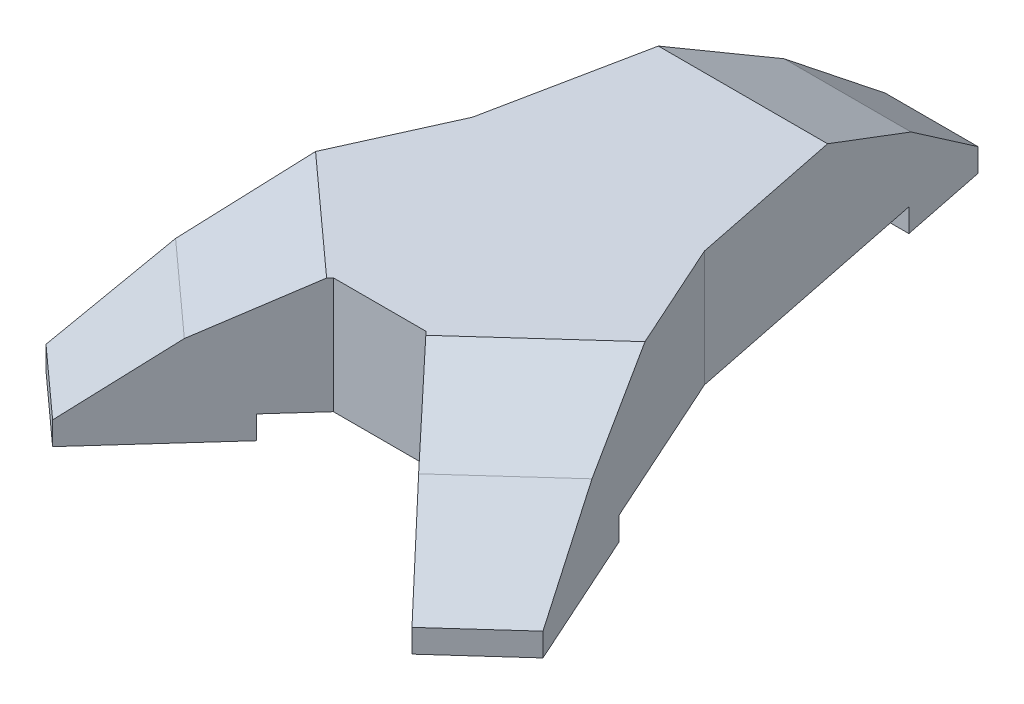
ISO-10303-21;
HEADER;
FILE_DESCRIPTION(('STEP AP214'),'2;1');
FILE_NAME('part.step','',(''),(''),'','','');
FILE_SCHEMA(('AUTOMOTIVE_DESIGN { 1 0 10303 214 1 1 1 1 }'));
ENDSEC;
DATA;
#1=APPLICATION_CONTEXT('core data for automotive mechanical design processes');
#2=APPLICATION_PROTOCOL_DEFINITION('international standard','automotive_design',2000,#1);
#3=PRODUCT_CONTEXT('',#1,'mechanical');
#4=PRODUCT('Part','Part','',(#3));
#5=PRODUCT_RELATED_PRODUCT_CATEGORY('part','',(#4));
#6=PRODUCT_DEFINITION_FORMATION('','',#4);
#7=PRODUCT_DEFINITION_CONTEXT('part definition',#1,'design');
#8=PRODUCT_DEFINITION('design','',#6,#7);
#9=PRODUCT_DEFINITION_SHAPE('','',#8);
#10=(LENGTH_UNIT() NAMED_UNIT(*) SI_UNIT(.MILLI.,.METRE.));
#11=(NAMED_UNIT(*) PLANE_ANGLE_UNIT() SI_UNIT($,.RADIAN.));
#12=(NAMED_UNIT(*) SI_UNIT($,.STERADIAN.) SOLID_ANGLE_UNIT());
#13=UNCERTAINTY_MEASURE_WITH_UNIT(LENGTH_MEASURE(1.E-05),#10,'distance_accuracy_value','');
#14=(GEOMETRIC_REPRESENTATION_CONTEXT(3) GLOBAL_UNCERTAINTY_ASSIGNED_CONTEXT((#13)) GLOBAL_UNIT_ASSIGNED_CONTEXT((#10,
#11,#12)) REPRESENTATION_CONTEXT('',''));
#15=CARTESIAN_POINT('',(0.,0.,0.));
#16=DIRECTION('',(0.,0.,1.));
#17=DIRECTION('',(1.,0.,0.));
#18=AXIS2_PLACEMENT_3D('',#15,#16,#17);
#19=CARTESIAN_POINT('',(-12.7,6.35,55.3152646220788));
#20=DIRECTION('',(0.,0.,-1.));
#21=DIRECTION('',(-1.,0.,0.));
#22=AXIS2_PLACEMENT_3D('',#19,#20,#21);
#23=PLANE('',#22);
#24=DIRECTION('',(-1.,0.,0.));
#25=VECTOR('',#24,1.);
#26=CARTESIAN_POINT('',(0.,6.35,55.3152646220788));
#27=LINE('',#26,#25);
#28=CARTESIAN_POINT('',(12.7,6.35,55.3152646220788));
#29=VERTEX_POINT('',#28);
#30=CARTESIAN_POINT('',(-12.7,6.35,55.3152646220788));
#31=VERTEX_POINT('',#30);
#32=EDGE_CURVE('E293',#29,#31,#27,.T.);
#33=ORIENTED_EDGE('',*,*,#32,.F.);
#34=DIRECTION('',(0.,-1.,0.));
#35=VECTOR('',#34,1.);
#36=CARTESIAN_POINT('',(12.7,6.35,55.3152646220788));
#37=LINE('',#36,#35);
#38=CARTESIAN_POINT('',(12.7,38.1,55.3152646220788));
#39=VERTEX_POINT('',#38);
#40=EDGE_CURVE('E209',#39,#29,#37,.T.);
#41=ORIENTED_EDGE('',*,*,#40,.F.);
#42=DIRECTION('',(1.,0.,0.));
#43=VECTOR('',#42,1.);
#44=CARTESIAN_POINT('',(0.,38.1,55.3152646220788));
#45=LINE('',#44,#43);
#46=CARTESIAN_POINT('',(-12.7,38.1,55.3152646220788));
#47=VERTEX_POINT('',#46);
#48=EDGE_CURVE('E299',#47,#39,#45,.T.);
#49=ORIENTED_EDGE('',*,*,#48,.F.);
#50=DIRECTION('',(0.,-1.,0.));
#51=VECTOR('',#50,1.);
#52=CARTESIAN_POINT('',(-12.7,6.35,55.3152646220788));
#53=LINE('',#52,#51);
#54=EDGE_CURVE('E345',#47,#31,#53,.T.);
#55=ORIENTED_EDGE('',*,*,#54,.T.);
#56=EDGE_LOOP('',(#33,#41,#49,#55));
#57=FACE_BOUND('',#56,.T.);
#58=ADVANCED_FACE('F32',(#57),#23,.F.);
#59=CARTESIAN_POINT('',(0.,0.,55.3152646220788));
#60=DIRECTION('',(0.,1.,0.));
#61=DIRECTION('',(0.,0.,1.));
#62=AXIS2_PLACEMENT_3D('',#59,#60,#61);
#63=PLANE('',#62);
#64=DIRECTION('',(-1.,0.,0.));
#65=VECTOR('',#64,1.);
#66=CARTESIAN_POINT('',(0.,0.,-95.814735377912));
#67=LINE('',#66,#65);
#68=CARTESIAN_POINT('',(12.7,0.,-95.814735377912));
#69=VERTEX_POINT('',#68);
#70=CARTESIAN_POINT('',(-12.7,0.,-95.814735377912));
#71=VERTEX_POINT('',#70);
#72=EDGE_CURVE('E326',#69,#71,#67,.T.);
#73=ORIENTED_EDGE('',*,*,#72,.F.);
#74=DIRECTION('',(0.198662427795257,0.,0.980067977123268));
#75=VECTOR('',#74,1.);
#76=CARTESIAN_POINT('',(12.7,0.,-95.814735377912));
#77=LINE('',#76,#75);
#78=CARTESIAN_POINT('',(17.5137930465512,0.,-72.0666896815926));
#79=VERTEX_POINT('',#78);
#80=EDGE_CURVE('E239',#69,#79,#77,.T.);
#81=ORIENTED_EDGE('',*,*,#80,.T.);
#82=DIRECTION('',(1.,0.,0.));
#83=VECTOR('',#82,1.);
#84=CARTESIAN_POINT('',(-17.5137930465512,0.,-72.0666896815926));
#85=LINE('',#84,#83);
#86=CARTESIAN_POINT('',(-17.5137930465512,0.,-72.0666896815926));
#87=VERTEX_POINT('',#86);
#88=EDGE_CURVE('E283',#87,#79,#85,.T.);
#89=ORIENTED_EDGE('',*,*,#88,.F.);
#90=DIRECTION('',(-0.198662427795257,0.,0.980067977123268));
#91=VECTOR('',#90,1.);
#92=CARTESIAN_POINT('',(-12.7,0.,-95.814735377912));
#93=LINE('',#92,#91);
#94=EDGE_CURVE('E347',#71,#87,#93,.T.);
#95=ORIENTED_EDGE('',*,*,#94,.F.);
#96=EDGE_LOOP('',(#73,#81,#89,#95));
#97=FACE_BOUND('',#96,.T.);
#98=ADVANCED_FACE('F393',(#97),#63,.F.);
#99=CARTESIAN_POINT('',(-49.2051840328091,6.35,95.7036977876351));
#100=DIRECTION('',(-0.741871355145552,0.,-0.670542237606627));
#101=DIRECTION('',(-0.670542237606627,0.,0.741871355145552));
#102=AXIS2_PLACEMENT_3D('',#99,#100,#101);
#103=PLANE('',#102);
#104=DIRECTION('',(0.670542237606627,0.,-0.741871355145552));
#105=VECTOR('',#104,1.);
#106=CARTESIAN_POINT('',(-49.2051840328091,0.,95.7036977876351));
#107=LINE('',#106,#105);
#108=CARTESIAN_POINT('',(-49.2051840328091,0.,95.7036977876351));
#109=VERTEX_POINT('',#108);
#110=CARTESIAN_POINT('',(-22.7010488999517,0.,66.3801778880448));
#111=VERTEX_POINT('',#110);
#112=EDGE_CURVE('E342',#109,#111,#107,.T.);
#113=ORIENTED_EDGE('',*,*,#112,.T.);
#114=DIRECTION('',(0.,-1.,0.));
#115=VECTOR('',#114,1.);
#116=CARTESIAN_POINT('',(-22.7010488999517,6.35,66.3801778880448));
#117=LINE('',#116,#115);
#118=CARTESIAN_POINT('',(-22.7010488999517,6.35,66.3801778880448));
#119=VERTEX_POINT('',#118);
#120=EDGE_CURVE('E49',#119,#111,#117,.T.);
#121=ORIENTED_EDGE('',*,*,#120,.F.);
#122=DIRECTION('',(-0.670542237606626,0.,0.741871355145553));
#123=VECTOR('',#122,1.);
#124=CARTESIAN_POINT('',(-12.7,6.35,55.3152646220788));
#125=LINE('',#124,#123);
#126=EDGE_CURVE('E280',#31,#119,#125,.T.);
#127=ORIENTED_EDGE('',*,*,#126,.F.);
#128=ORIENTED_EDGE('',*,*,#54,.F.);
#129=DIRECTION('',(-0.670542237606627,0.,0.741871355145552));
#130=VECTOR('',#129,1.);
#131=CARTESIAN_POINT('',(-13.5797727730859,38.1,56.2886234692694));
#132=LINE('',#131,#130);
#133=CARTESIAN_POINT('',(-13.5797727730859,38.1,56.2886234692694));
#134=VERTEX_POINT('',#133);
#135=EDGE_CURVE('E313',#47,#134,#132,.T.);
#136=ORIENTED_EDGE('',*,*,#135,.T.);
#137=DIRECTION('',(-0.603448054828355,-0.436012915201094,0.667640009961745));
#138=VECTOR('',#137,1.);
#139=CARTESIAN_POINT('',(-32.0789925620562,24.7336486055474,76.7557029227042));
#140=LINE('',#139,#138);
#141=CARTESIAN_POINT('',(-32.0789925620562,24.7336486055474,76.7557029227042));
#142=VERTEX_POINT('',#141);
#143=EDGE_CURVE('E328',#134,#142,#140,.T.);
#144=ORIENTED_EDGE('',*,*,#143,.T.);
#145=DIRECTION('',(-0.544225984758208,-0.584184713973834,0.602118175670913));
#146=VECTOR('',#145,1.);
#147=CARTESIAN_POINT('',(-49.2051840328091,6.35,95.7036977876351));
#148=LINE('',#147,#146);
#149=CARTESIAN_POINT('',(-49.2051840328091,6.35,95.7036977876351));
#150=VERTEX_POINT('',#149);
#151=EDGE_CURVE('E331',#142,#150,#148,.T.);
#152=ORIENTED_EDGE('',*,*,#151,.T.);
#153=DIRECTION('',(0.,-1.,0.));
#154=VECTOR('',#153,1.);
#155=CARTESIAN_POINT('',(-49.2051840328091,6.35,95.7036977876351));
#156=LINE('',#155,#154);
#157=EDGE_CURVE('E356',#150,#109,#156,.T.);
#158=ORIENTED_EDGE('',*,*,#157,.T.);
#159=EDGE_LOOP('',(#113,#121,#127,#128,#136,#144,#152,#158));
#160=FACE_BOUND('',#159,.T.);
#161=ADVANCED_FACE('F409',(#160),#103,.F.);
#162=CARTESIAN_POINT('',(-31.75,6.35,-1.83473537791201));
#163=DIRECTION('',(0.911621588614959,0.,0.411030508808213));
#164=DIRECTION('',(0.411030508808214,0.,-0.911621588614959));
#165=AXIS2_PLACEMENT_3D('',#162,#163,#164);
#166=PLANE('',#165);
#167=DIRECTION('',(0.411030508808214,0.,-0.911621588614959));
#168=VECTOR('',#167,1.);
#169=CARTESIAN_POINT('',(-50.9815492834304,6.35,40.8187784941399));
#170=LINE('',#169,#168);
#171=CARTESIAN_POINT('',(-50.9815492834304,6.35,40.8187784941399));
#172=VERTEX_POINT('',#171);
#173=CARTESIAN_POINT('',(-31.75,6.35,-1.83473537791201));
#174=VERTEX_POINT('',#173);
#175=EDGE_CURVE('E286',#172,#174,#170,.T.);
#176=ORIENTED_EDGE('',*,*,#175,.F.);
#177=DIRECTION('',(0.,-1.,0.));
#178=VECTOR('',#177,1.);
#179=CARTESIAN_POINT('',(-50.9815492834304,6.35,40.8187784941399));
#180=LINE('',#179,#178);
#181=CARTESIAN_POINT('',(-50.9815492834304,0.,40.8187784941399));
#182=VERTEX_POINT('',#181);
#183=EDGE_CURVE('E300',#172,#182,#180,.T.);
#184=ORIENTED_EDGE('',*,*,#183,.T.);
#185=DIRECTION('',(-0.411030508808214,0.,0.911621588614959));
#186=VECTOR('',#185,1.);
#187=CARTESIAN_POINT('',(-31.75,0.,-1.83473537791201));
#188=LINE('',#187,#186);
#189=CARTESIAN_POINT('',(-68.0487164535061,0.,78.6719249524268));
#190=VERTEX_POINT('',#189);
#191=EDGE_CURVE('E350',#182,#190,#188,.T.);
#192=ORIENTED_EDGE('',*,*,#191,.T.);
#193=DIRECTION('',(0.,-1.,0.));
#194=VECTOR('',#193,1.);
#195=CARTESIAN_POINT('',(-68.0487164535061,6.35,78.6719249524268));
#196=LINE('',#195,#194);
#197=CARTESIAN_POINT('',(-68.0487164535061,6.35,78.6719249524268));
#198=VERTEX_POINT('',#197);
#199=EDGE_CURVE('E359',#198,#190,#196,.T.);
#200=ORIENTED_EDGE('',*,*,#199,.F.);
#201=DIRECTION('',(0.339075065566947,0.565221878622035,-0.752032132184356));
#202=VECTOR('',#201,1.);
#203=CARTESIAN_POINT('',(-56.1172254727613,26.2392234544651,52.2091575195431));
#204=LINE('',#203,#202);
#205=CARTESIAN_POINT('',(-57.0204157240964,24.7336486055474,54.2123366366627));
#206=VERTEX_POINT('',#205);
#207=EDGE_CURVE('E324',#198,#206,#204,.T.);
#208=ORIENTED_EDGE('',*,*,#207,.T.);
#209=DIRECTION('',(0.373247600320152,0.418801936448978,-0.827823149520376));
#210=VECTOR('',#209,1.);
#211=CARTESIAN_POINT('',(-43.416255905428,39.998176685387,24.0397691023803));
#212=LINE('',#211,#210);
#213=CARTESIAN_POINT('',(-45.1079622495095,38.1,27.7917923508082));
#214=VERTEX_POINT('',#213);
#215=EDGE_CURVE('E321',#206,#214,#212,.T.);
#216=ORIENTED_EDGE('',*,*,#215,.T.);
#217=DIRECTION('',(0.411030508808214,0.,-0.911621588614959));
#218=VECTOR('',#217,1.);
#219=CARTESIAN_POINT('',(-29.728151821124,38.1,-6.31897781069268));
#220=LINE('',#219,#218);
#221=CARTESIAN_POINT('',(-31.75,38.1,-1.83473537791195));
#222=VERTEX_POINT('',#221);
#223=EDGE_CURVE('E319',#214,#222,#220,.T.);
#224=ORIENTED_EDGE('',*,*,#223,.T.);
#225=DIRECTION('',(0.,-1.,0.));
#226=VECTOR('',#225,1.);
#227=CARTESIAN_POINT('',(-31.75,6.35,-1.83473537791201));
#228=LINE('',#227,#226);
#229=EDGE_CURVE('E41',#222,#174,#228,.T.);
#230=ORIENTED_EDGE('',*,*,#229,.T.);
#231=EDGE_LOOP('',(#176,#184,#192,#200,#208,#216,#224,#230));
#232=FACE_BOUND('',#231,.T.);
#233=ADVANCED_FACE('F367',(#232),#166,.F.);
#234=CARTESIAN_POINT('',(0.,6.35,-95.814735377912));
#235=DIRECTION('',(0.,0.,1.));
#236=DIRECTION('',(1.,0.,0.));
#237=AXIS2_PLACEMENT_3D('',#234,#235,#236);
#238=PLANE('',#237);
#239=ORIENTED_EDGE('',*,*,#72,.T.);
#240=DIRECTION('',(0.,-1.,0.));
#241=VECTOR('',#240,1.);
#242=CARTESIAN_POINT('',(-12.7,6.35,-95.814735377912));
#243=LINE('',#242,#241);
#244=CARTESIAN_POINT('',(-12.7,6.35,-95.814735377912));
#245=VERTEX_POINT('',#244);
#246=EDGE_CURVE('E11',#245,#71,#243,.T.);
#247=ORIENTED_EDGE('',*,*,#246,.F.);
#248=DIRECTION('',(-1.,0.,0.));
#249=VECTOR('',#248,1.);
#250=CARTESIAN_POINT('',(0.,6.35,-95.814735377912));
#251=LINE('',#250,#249);
#252=CARTESIAN_POINT('',(12.7,6.35,-95.814735377912));
#253=VERTEX_POINT('',#252);
#254=EDGE_CURVE('E338',#253,#245,#251,.T.);
#255=ORIENTED_EDGE('',*,*,#254,.F.);
#256=DIRECTION('',(0.,-1.,0.));
#257=VECTOR('',#256,1.);
#258=CARTESIAN_POINT('',(12.7,6.35,-95.814735377912));
#259=LINE('',#258,#257);
#260=EDGE_CURVE('E269',#253,#69,#259,.T.);
#261=ORIENTED_EDGE('',*,*,#260,.T.);
#262=EDGE_LOOP('',(#239,#247,#255,#261));
#263=FACE_BOUND('',#262,.T.);
#264=ADVANCED_FACE('F34',(#263),#238,.F.);
#265=CARTESIAN_POINT('',(-12.7,6.35,-95.814735377912));
#266=DIRECTION('',(0.980067977123268,0.,0.198662427795257));
#267=DIRECTION('',(0.198662427795257,0.,-0.980067977123268));
#268=AXIS2_PLACEMENT_3D('',#265,#266,#267);
#269=PLANE('',#268);
#270=ORIENTED_EDGE('',*,*,#94,.T.);
#271=DIRECTION('',(0.,-1.,0.));
#272=VECTOR('',#271,1.);
#273=CARTESIAN_POINT('',(-17.5137930465512,6.35,-72.0666896815926));
#274=LINE('',#273,#272);
#275=CARTESIAN_POINT('',(-17.5137930465512,6.35,-72.0666896815926));
#276=VERTEX_POINT('',#275);
#277=EDGE_CURVE('E297',#276,#87,#274,.T.);
#278=ORIENTED_EDGE('',*,*,#277,.F.);
#279=DIRECTION('',(0.198662427795257,0.,-0.980067977123268));
#280=VECTOR('',#279,1.);
#281=CARTESIAN_POINT('',(-31.75,6.35,-1.83473537791201));
#282=LINE('',#281,#280);
#283=EDGE_CURVE('E288',#174,#276,#282,.T.);
#284=ORIENTED_EDGE('',*,*,#283,.F.);
#285=ORIENTED_EDGE('',*,*,#229,.F.);
#286=DIRECTION('',(-0.198662427795257,0.,0.980067977123268));
#287=VECTOR('',#286,1.);
#288=CARTESIAN_POINT('',(-35.3289254631246,38.1,15.8212969068361));
#289=LINE('',#288,#287);
#290=CARTESIAN_POINT('',(-23.172431216904,38.1,-44.1507413745192));
#291=VERTEX_POINT('',#290);
#292=EDGE_CURVE('E306',#291,#222,#289,.T.);
#293=ORIENTED_EDGE('',*,*,#292,.F.);
#294=DIRECTION('',(-0.178136601307639,0.442679566158868,0.878807233117684));
#295=VECTOR('',#294,1.);
#296=CARTESIAN_POINT('',(-26.322200819078,45.9273562578125,-28.6118780037939));
#297=LINE('',#296,#295);
#298=CARTESIAN_POINT('',(-17.3671205335689,23.6734734139333,-72.7902740789722));
#299=VERTEX_POINT('',#298);
#300=EDGE_CURVE('E310',#299,#291,#297,.T.);
#301=ORIENTED_EDGE('',*,*,#300,.F.);
#302=DIRECTION('',(-0.159891923663756,0.593488740813308,0.788800156741197));
#303=VECTOR('',#302,1.);
#304=CARTESIAN_POINT('',(-20.0531495283154,33.6435077305664,-59.5391977048896));
#305=LINE('',#304,#303);
#306=EDGE_CURVE('E309',#245,#299,#305,.T.);
#307=ORIENTED_EDGE('',*,*,#306,.F.);
#308=ORIENTED_EDGE('',*,*,#246,.T.);
#309=EDGE_LOOP('',(#270,#278,#284,#285,#293,#301,#307,#308));
#310=FACE_BOUND('',#309,.T.);
#311=ADVANCED_FACE('F375',(#310),#269,.F.);
#312=CARTESIAN_POINT('',(-68.0487164535061,6.35,78.6719249524268));
#313=DIRECTION('',(0.670542237606627,0.,-0.741871355145552));
#314=DIRECTION('',(-0.741871355145552,0.,-0.670542237606627));
#315=AXIS2_PLACEMENT_3D('',#312,#313,#314);
#316=PLANE('',#315);
#317=DIRECTION('',(0.741871355145552,0.,0.670542237606627));
#318=VECTOR('',#317,1.);
#319=CARTESIAN_POINT('',(-68.0487164535061,0.,78.6719249524268));
#320=LINE('',#319,#318);
#321=EDGE_CURVE('E352',#190,#109,#320,.T.);
#322=ORIENTED_EDGE('',*,*,#321,.T.);
#323=ORIENTED_EDGE('',*,*,#157,.F.);
#324=DIRECTION('',(0.741871355145552,0.,0.670542237606627));
#325=VECTOR('',#324,1.);
#326=CARTESIAN_POINT('',(-68.0487164535061,6.35,78.6719249524268));
#327=LINE('',#326,#325);
#328=EDGE_CURVE('E341',#198,#150,#327,.T.);
#329=ORIENTED_EDGE('',*,*,#328,.F.);
#330=ORIENTED_EDGE('',*,*,#199,.T.);
#331=EDGE_LOOP('',(#322,#323,#329,#330));
#332=FACE_BOUND('',#331,.T.);
#333=ADVANCED_FACE('F406',(#332),#316,.F.);
#334=ORIENTED_EDGE('',*,*,#191,.F.);
#335=DIRECTION('',(-0.741871355145552,0.,-0.670542237606627));
#336=VECTOR('',#335,1.);
#337=CARTESIAN_POINT('',(-22.7010488999517,0.,66.3801778880448));
#338=LINE('',#337,#336);
#339=EDGE_CURVE('E272',#111,#182,#338,.T.);
#340=ORIENTED_EDGE('',*,*,#339,.F.);
#341=ORIENTED_EDGE('',*,*,#112,.F.);
#342=ORIENTED_EDGE('',*,*,#321,.F.);
#343=EDGE_LOOP('',(#334,#340,#341,#342));
#344=FACE_BOUND('',#343,.T.);
#345=ADVANCED_FACE('F403',(#344),#63,.F.);
#346=CARTESIAN_POINT('',(-171.346065287698,6.35,-14.6936362674454));
#347=DIRECTION('',(-0.391720525283602,0.811620736526187,0.433389905411085));
#348=DIRECTION('',(0.,-0.471032847970125,0.882115670495176));
#349=AXIS2_PLACEMENT_3D('',#346,#347,#348);
#350=PLANE('',#349);
#351=ORIENTED_EDGE('',*,*,#207,.F.);
#352=ORIENTED_EDGE('',*,*,#328,.T.);
#353=ORIENTED_EDGE('',*,*,#151,.F.);
#354=DIRECTION('',(0.741871355145552,0.,0.670542237606627));
#355=VECTOR('',#354,1.);
#356=CARTESIAN_POINT('',(-154.219873816946,24.7336486055474,-33.6416311323763));
#357=LINE('',#356,#355);
#358=EDGE_CURVE('E322',#206,#142,#357,.T.);
#359=ORIENTED_EDGE('',*,*,#358,.F.);
#360=EDGE_LOOP('',(#351,#352,#353,#359));
#361=FACE_BOUND('',#360,.T.);
#362=ADVANCED_FACE('F415',(#361),#350,.T.);
#363=CARTESIAN_POINT('',(-154.219873816946,24.7336486055474,-33.6416311323763));
#364=DIRECTION('',(-0.29236507578433,0.899940407903681,0.323465492261198));
#365=DIRECTION('',(0.,-0.338244481942432,0.941058271540873));
#366=AXIS2_PLACEMENT_3D('',#363,#364,#365);
#367=PLANE('',#366);
#368=ORIENTED_EDGE('',*,*,#215,.F.);
#369=ORIENTED_EDGE('',*,*,#358,.T.);
#370=ORIENTED_EDGE('',*,*,#143,.F.);
#371=DIRECTION('',(0.741871355145552,0.,0.670542237606627));
#372=VECTOR('',#371,1.);
#373=CARTESIAN_POINT('',(-135.720654027975,38.1,-54.1087105858111));
#374=LINE('',#373,#372);
#375=EDGE_CURVE('E334',#214,#134,#374,.T.);
#376=ORIENTED_EDGE('',*,*,#375,.F.);
#377=EDGE_LOOP('',(#368,#369,#370,#376));
#378=FACE_BOUND('',#377,.T.);
#379=ADVANCED_FACE('F417',(#378),#367,.T.);
#380=CARTESIAN_POINT('',(-135.720654027975,38.1,-54.1087105858111));
#381=DIRECTION('',(0.,1.,0.));
#382=DIRECTION('',(0.,0.,1.));
#383=AXIS2_PLACEMENT_3D('',#380,#381,#382);
#384=PLANE('',#383);
#385=ORIENTED_EDGE('',*,*,#48,.T.);
#386=DIRECTION('',(0.670542237606627,0.,0.741871355145552));
#387=VECTOR('',#386,1.);
#388=CARTESIAN_POINT('',(13.5797727730859,38.1,56.2886234692694));
#389=LINE('',#388,#387);
#390=CARTESIAN_POINT('',(13.5797727730859,38.1,56.2886234692694));
#391=VERTEX_POINT('',#390);
#392=EDGE_CURVE('E226',#39,#391,#389,.T.);
#393=ORIENTED_EDGE('',*,*,#392,.T.);
#394=DIRECTION('',(-0.741871355145552,0.,0.670542237606627));
#395=VECTOR('',#394,1.);
#396=CARTESIAN_POINT('',(135.720654027975,38.1,-54.1087105858111));
#397=LINE('',#396,#395);
#398=CARTESIAN_POINT('',(45.1079622495095,38.1,27.7917923508082));
#399=VERTEX_POINT('',#398);
#400=EDGE_CURVE('E248',#399,#391,#397,.T.);
#401=ORIENTED_EDGE('',*,*,#400,.F.);
#402=DIRECTION('',(-0.411030508808214,0.,-0.911621588614959));
#403=VECTOR('',#402,1.);
#404=CARTESIAN_POINT('',(29.728151821124,38.1,-6.31897781069268));
#405=LINE('',#404,#403);
#406=CARTESIAN_POINT('',(31.75,38.1,-1.83473537791195));
#407=VERTEX_POINT('',#406);
#408=EDGE_CURVE('E229',#399,#407,#405,.T.);
#409=ORIENTED_EDGE('',*,*,#408,.T.);
#410=DIRECTION('',(0.198662427795257,0.,0.980067977123268));
#411=VECTOR('',#410,1.);
#412=CARTESIAN_POINT('',(35.3289254631246,38.1,15.8212969068361));
#413=LINE('',#412,#411);
#414=CARTESIAN_POINT('',(23.172431216904,38.1,-44.1507413745192));
#415=VERTEX_POINT('',#414);
#416=EDGE_CURVE('E221',#415,#407,#413,.T.);
#417=ORIENTED_EDGE('',*,*,#416,.F.);
#418=DIRECTION('',(1.,0.,0.));
#419=VECTOR('',#418,1.);
#420=CARTESIAN_POINT('',(-122.432018067882,38.1,-44.1507413745192));
#421=LINE('',#420,#419);
#422=EDGE_CURVE('E315',#291,#415,#421,.T.);
#423=ORIENTED_EDGE('',*,*,#422,.F.);
#424=ORIENTED_EDGE('',*,*,#292,.T.);
#425=ORIENTED_EDGE('',*,*,#223,.F.);
#426=ORIENTED_EDGE('',*,*,#375,.T.);
#427=ORIENTED_EDGE('',*,*,#135,.F.);
#428=EDGE_LOOP('',(#385,#393,#401,#409,#417,#423,#424,#425,#426,#427));
#429=FACE_BOUND('',#428,.T.);
#430=ADVANCED_FACE('F373',(#429),#384,.T.);
#431=CARTESIAN_POINT('',(-122.432018067882,38.1,-44.1507413745192));
#432=DIRECTION('',(0.,-0.893091546594061,0.449874970855489));
#433=DIRECTION('',(0.,-0.44987497085549,-0.893091546594062));
#434=AXIS2_PLACEMENT_3D('',#431,#432,#433);
#435=PLANE('',#434);
#436=DIRECTION('',(1.,0.,0.));
#437=VECTOR('',#436,1.);
#438=CARTESIAN_POINT('',(-122.432018067882,23.6734734139333,-72.7902740789722));
#439=LINE('',#438,#437);
#440=CARTESIAN_POINT('',(17.3671205335689,23.6734734139333,-72.7902740789722));
#441=VERTEX_POINT('',#440);
#442=EDGE_CURVE('E305',#299,#441,#439,.T.);
#443=ORIENTED_EDGE('',*,*,#442,.F.);
#444=ORIENTED_EDGE('',*,*,#300,.T.);
#445=ORIENTED_EDGE('',*,*,#422,.T.);
#446=DIRECTION('',(0.178136601307639,0.442679566158868,0.878807233117684));
#447=VECTOR('',#446,1.);
#448=CARTESIAN_POINT('',(26.322200819078,45.9273562578125,-28.6118780037939));
#449=LINE('',#448,#447);
#450=EDGE_CURVE('E219',#441,#415,#449,.T.);
#451=ORIENTED_EDGE('',*,*,#450,.F.);
#452=EDGE_LOOP('',(#443,#444,#445,#451));
#453=FACE_BOUND('',#452,.T.);
#454=ADVANCED_FACE('F383',(#453),#435,.F.);
#455=CARTESIAN_POINT('',(-122.432018067882,23.6734734139333,-72.7902740789722));
#456=DIRECTION('',(0.,-0.799080708690871,0.601223769488613));
#457=DIRECTION('',(0.,-0.601223769488613,-0.79908070869087));
#458=AXIS2_PLACEMENT_3D('',#455,#456,#457);
#459=PLANE('',#458);
#460=ORIENTED_EDGE('',*,*,#254,.T.);
#461=ORIENTED_EDGE('',*,*,#306,.T.);
#462=ORIENTED_EDGE('',*,*,#442,.T.);
#463=DIRECTION('',(0.159891923663756,0.593488740813308,0.788800156741197));
#464=VECTOR('',#463,1.);
#465=CARTESIAN_POINT('',(20.0531495283154,33.6435077305664,-59.5391977048896));
#466=LINE('',#465,#464);
#467=EDGE_CURVE('E223',#253,#441,#466,.T.);
#468=ORIENTED_EDGE('',*,*,#467,.F.);
#469=EDGE_LOOP('',(#460,#461,#462,#468));
#470=FACE_BOUND('',#469,.T.);
#471=ADVANCED_FACE('F380',(#470),#459,.F.);
#472=CARTESIAN_POINT('',(-17.5137930465512,6.35,-72.0666896815926));
#473=DIRECTION('',(0.,0.,-1.));
#474=DIRECTION('',(-1.,0.,0.));
#475=AXIS2_PLACEMENT_3D('',#472,#473,#474);
#476=PLANE('',#475);
#477=ORIENTED_EDGE('',*,*,#88,.T.);
#478=DIRECTION('',(0.,-1.,0.));
#479=VECTOR('',#478,1.);
#480=CARTESIAN_POINT('',(17.5137930465512,6.35,-72.0666896815926));
#481=LINE('',#480,#479);
#482=CARTESIAN_POINT('',(17.5137930465512,6.35,-72.0666896815926));
#483=VERTEX_POINT('',#482);
#484=EDGE_CURVE('E216',#483,#79,#481,.T.);
#485=ORIENTED_EDGE('',*,*,#484,.F.);
#486=DIRECTION('',(1.,0.,0.));
#487=VECTOR('',#486,1.);
#488=CARTESIAN_POINT('',(-17.5137930465512,6.35,-72.0666896815926));
#489=LINE('',#488,#487);
#490=EDGE_CURVE('E291',#276,#483,#489,.T.);
#491=ORIENTED_EDGE('',*,*,#490,.F.);
#492=ORIENTED_EDGE('',*,*,#277,.T.);
#493=EDGE_LOOP('',(#477,#485,#491,#492));
#494=FACE_BOUND('',#493,.T.);
#495=ADVANCED_FACE('F396',(#494),#476,.F.);
#496=CARTESIAN_POINT('',(-22.7010488999517,6.35,66.3801778880448));
#497=DIRECTION('',(-0.670542237606627,0.,0.741871355145552));
#498=DIRECTION('',(0.741871355145552,0.,0.670542237606627));
#499=AXIS2_PLACEMENT_3D('',#496,#497,#498);
#500=PLANE('',#499);
#501=ORIENTED_EDGE('',*,*,#339,.T.);
#502=ORIENTED_EDGE('',*,*,#183,.F.);
#503=DIRECTION('',(-0.741871355145552,0.,-0.670542237606627));
#504=VECTOR('',#503,1.);
#505=CARTESIAN_POINT('',(-22.7010488999517,6.35,66.3801778880448));
#506=LINE('',#505,#504);
#507=EDGE_CURVE('E282',#119,#172,#506,.T.);
#508=ORIENTED_EDGE('',*,*,#507,.F.);
#509=ORIENTED_EDGE('',*,*,#120,.T.);
#510=EDGE_LOOP('',(#501,#502,#508,#509));
#511=FACE_BOUND('',#510,.T.);
#512=ADVANCED_FACE('F399',(#511),#500,.F.);
#513=CARTESIAN_POINT('',(-22.7010488999517,6.35,66.3801778880448));
#514=DIRECTION('',(0.,-1.,0.));
#515=DIRECTION('',(0.,0.,-1.));
#516=AXIS2_PLACEMENT_3D('',#513,#514,#515);
#517=PLANE('',#516);
#518=ORIENTED_EDGE('',*,*,#126,.T.);
#519=ORIENTED_EDGE('',*,*,#507,.T.);
#520=ORIENTED_EDGE('',*,*,#175,.T.);
#521=ORIENTED_EDGE('',*,*,#283,.T.);
#522=ORIENTED_EDGE('',*,*,#490,.T.);
#523=DIRECTION('',(-0.198662427795257,0.,-0.980067977123268));
#524=VECTOR('',#523,1.);
#525=CARTESIAN_POINT('',(31.75,6.35,-1.83473537791201));
#526=LINE('',#525,#524);
#527=CARTESIAN_POINT('',(31.75,6.35,-1.83473537791201));
#528=VERTEX_POINT('',#527);
#529=EDGE_CURVE('E204',#528,#483,#526,.T.);
#530=ORIENTED_EDGE('',*,*,#529,.F.);
#531=DIRECTION('',(-0.411030508808214,0.,-0.911621588614959));
#532=VECTOR('',#531,1.);
#533=CARTESIAN_POINT('',(50.9815492834304,6.35,40.8187784941399));
#534=LINE('',#533,#532);
#535=CARTESIAN_POINT('',(50.9815492834304,6.35,40.8187784941399));
#536=VERTEX_POINT('',#535);
#537=EDGE_CURVE('E191',#536,#528,#534,.T.);
#538=ORIENTED_EDGE('',*,*,#537,.F.);
#539=DIRECTION('',(0.741871355145552,0.,-0.670542237606627));
#540=VECTOR('',#539,1.);
#541=CARTESIAN_POINT('',(22.7010488999517,6.35,66.3801778880448));
#542=LINE('',#541,#540);
#543=CARTESIAN_POINT('',(22.7010488999517,6.35,66.3801778880448));
#544=VERTEX_POINT('',#543);
#545=EDGE_CURVE('E183',#544,#536,#542,.T.);
#546=ORIENTED_EDGE('',*,*,#545,.F.);
#547=DIRECTION('',(0.670542237606626,0.,0.741871355145553));
#548=VECTOR('',#547,1.);
#549=CARTESIAN_POINT('',(12.7,6.35,55.3152646220788));
#550=LINE('',#549,#548);
#551=EDGE_CURVE('E188',#29,#544,#550,.T.);
#552=ORIENTED_EDGE('',*,*,#551,.F.);
#553=ORIENTED_EDGE('',*,*,#32,.T.);
#554=EDGE_LOOP('',(#518,#519,#520,#521,#522,#530,#538,#546,#552,#553));
#555=FACE_BOUND('',#554,.T.);
#556=ADVANCED_FACE('F186',(#555),#517,.T.);
#557=CARTESIAN_POINT('',(49.2051840328091,6.35,95.7036977876351));
#558=DIRECTION('',(0.741871355145552,0.,-0.670542237606627));
#559=DIRECTION('',(0.670542237606627,0.,0.741871355145552));
#560=AXIS2_PLACEMENT_3D('',#557,#558,#559);
#561=PLANE('',#560);
#562=DIRECTION('',(-0.670542237606627,0.,-0.741871355145552));
#563=VECTOR('',#562,1.);
#564=CARTESIAN_POINT('',(49.2051840328091,0.,95.7036977876351));
#565=LINE('',#564,#563);
#566=CARTESIAN_POINT('',(49.2051840328091,0.,95.7036977876351));
#567=VERTEX_POINT('',#566);
#568=CARTESIAN_POINT('',(22.7010488999517,0.,66.3801778880448));
#569=VERTEX_POINT('',#568);
#570=EDGE_CURVE('E253',#567,#569,#565,.T.);
#571=ORIENTED_EDGE('',*,*,#570,.F.);
#572=DIRECTION('',(0.,-1.,0.));
#573=VECTOR('',#572,1.);
#574=CARTESIAN_POINT('',(49.2051840328091,6.35,95.7036977876351));
#575=LINE('',#574,#573);
#576=CARTESIAN_POINT('',(49.2051840328091,6.35,95.7036977876351));
#577=VERTEX_POINT('',#576);
#578=EDGE_CURVE('E262',#577,#567,#575,.T.);
#579=ORIENTED_EDGE('',*,*,#578,.F.);
#580=DIRECTION('',(0.544225984758208,-0.584184713973834,0.602118175670913));
#581=VECTOR('',#580,1.);
#582=CARTESIAN_POINT('',(49.2051840328091,6.35,95.7036977876351));
#583=LINE('',#582,#581);
#584=CARTESIAN_POINT('',(32.0789925620562,24.7336486055474,76.7557029227042));
#585=VERTEX_POINT('',#584);
#586=EDGE_CURVE('E245',#585,#577,#583,.T.);
#587=ORIENTED_EDGE('',*,*,#586,.F.);
#588=DIRECTION('',(0.603448054828355,-0.436012915201094,0.667640009961745));
#589=VECTOR('',#588,1.);
#590=CARTESIAN_POINT('',(32.0789925620562,24.7336486055474,76.7557029227042));
#591=LINE('',#590,#589);
#592=EDGE_CURVE('E242',#391,#585,#591,.T.);
#593=ORIENTED_EDGE('',*,*,#592,.F.);
#594=ORIENTED_EDGE('',*,*,#392,.F.);
#595=ORIENTED_EDGE('',*,*,#40,.T.);
#596=ORIENTED_EDGE('',*,*,#551,.T.);
#597=DIRECTION('',(0.,-1.,0.));
#598=VECTOR('',#597,1.);
#599=CARTESIAN_POINT('',(22.7010488999517,6.35,66.3801778880448));
#600=LINE('',#599,#598);
#601=EDGE_CURVE('E197',#544,#569,#600,.T.);
#602=ORIENTED_EDGE('',*,*,#601,.T.);
#603=EDGE_LOOP('',(#571,#579,#587,#593,#594,#595,#596,#602));
#604=FACE_BOUND('',#603,.T.);
#605=ADVANCED_FACE('F206',(#604),#561,.F.);
#606=CARTESIAN_POINT('',(31.75,6.35,-1.83473537791201));
#607=DIRECTION('',(-0.911621588614959,0.,0.411030508808213));
#608=DIRECTION('',(-0.411030508808214,0.,-0.911621588614959));
#609=AXIS2_PLACEMENT_3D('',#606,#607,#608);
#610=PLANE('',#609);
#611=ORIENTED_EDGE('',*,*,#537,.T.);
#612=DIRECTION('',(0.,-1.,0.));
#613=VECTOR('',#612,1.);
#614=CARTESIAN_POINT('',(31.75,6.35,-1.83473537791201));
#615=LINE('',#614,#613);
#616=EDGE_CURVE('E268',#407,#528,#615,.T.);
#617=ORIENTED_EDGE('',*,*,#616,.F.);
#618=ORIENTED_EDGE('',*,*,#408,.F.);
#619=DIRECTION('',(-0.373247600320152,0.418801936448978,-0.827823149520376));
#620=VECTOR('',#619,1.);
#621=CARTESIAN_POINT('',(43.416255905428,39.998176685387,24.0397691023803));
#622=LINE('',#621,#620);
#623=CARTESIAN_POINT('',(57.0204157240964,24.7336486055474,54.2123366366627));
#624=VERTEX_POINT('',#623);
#625=EDGE_CURVE('E232',#624,#399,#622,.T.);
#626=ORIENTED_EDGE('',*,*,#625,.F.);
#627=DIRECTION('',(-0.339075065566947,0.565221878622035,-0.752032132184356));
#628=VECTOR('',#627,1.);
#629=CARTESIAN_POINT('',(56.1172254727613,26.2392234544651,52.2091575195431));
#630=LINE('',#629,#628);
#631=CARTESIAN_POINT('',(68.0487164535061,6.35,78.6719249524268));
#632=VERTEX_POINT('',#631);
#633=EDGE_CURVE('E236',#632,#624,#630,.T.);
#634=ORIENTED_EDGE('',*,*,#633,.F.);
#635=DIRECTION('',(0.,-1.,0.));
#636=VECTOR('',#635,1.);
#637=CARTESIAN_POINT('',(68.0487164535061,6.35,78.6719249524268));
#638=LINE('',#637,#636);
#639=CARTESIAN_POINT('',(68.0487164535061,0.,78.6719249524268));
#640=VERTEX_POINT('',#639);
#641=EDGE_CURVE('E265',#632,#640,#638,.T.);
#642=ORIENTED_EDGE('',*,*,#641,.T.);
#643=DIRECTION('',(0.411030508808214,0.,0.911621588614959));
#644=VECTOR('',#643,1.);
#645=CARTESIAN_POINT('',(31.75,0.,-1.83473537791201));
#646=LINE('',#645,#644);
#647=CARTESIAN_POINT('',(50.9815492834304,0.,40.8187784941399));
#648=VERTEX_POINT('',#647);
#649=EDGE_CURVE('E256',#648,#640,#646,.T.);
#650=ORIENTED_EDGE('',*,*,#649,.F.);
#651=DIRECTION('',(0.,-1.,0.));
#652=VECTOR('',#651,1.);
#653=CARTESIAN_POINT('',(50.9815492834304,6.35,40.8187784941399));
#654=LINE('',#653,#652);
#655=EDGE_CURVE('E203',#536,#648,#654,.T.);
#656=ORIENTED_EDGE('',*,*,#655,.F.);
#657=EDGE_LOOP('',(#611,#617,#618,#626,#634,#642,#650,#656));
#658=FACE_BOUND('',#657,.T.);
#659=ADVANCED_FACE('F582',(#658),#610,.F.);
#660=CARTESIAN_POINT('',(12.7,6.35,-95.814735377912));
#661=DIRECTION('',(-0.980067977123268,0.,0.198662427795257));
#662=DIRECTION('',(-0.198662427795257,0.,-0.980067977123268));
#663=AXIS2_PLACEMENT_3D('',#660,#661,#662);
#664=PLANE('',#663);
#665=ORIENTED_EDGE('',*,*,#80,.F.);
#666=ORIENTED_EDGE('',*,*,#260,.F.);
#667=ORIENTED_EDGE('',*,*,#467,.T.);
#668=ORIENTED_EDGE('',*,*,#450,.T.);
#669=ORIENTED_EDGE('',*,*,#416,.T.);
#670=ORIENTED_EDGE('',*,*,#616,.T.);
#671=ORIENTED_EDGE('',*,*,#529,.T.);
#672=ORIENTED_EDGE('',*,*,#484,.T.);
#673=EDGE_LOOP('',(#665,#666,#667,#668,#669,#670,#671,#672));
#674=FACE_BOUND('',#673,.T.);
#675=ADVANCED_FACE('F387',(#674),#664,.F.);
#676=CARTESIAN_POINT('',(68.0487164535061,6.35,78.6719249524268));
#677=DIRECTION('',(-0.670542237606627,0.,-0.741871355145552));
#678=DIRECTION('',(0.741871355145552,0.,-0.670542237606627));
#679=AXIS2_PLACEMENT_3D('',#676,#677,#678);
#680=PLANE('',#679);
#681=DIRECTION('',(-0.741871355145552,0.,0.670542237606627));
#682=VECTOR('',#681,1.);
#683=CARTESIAN_POINT('',(68.0487164535061,0.,78.6719249524268));
#684=LINE('',#683,#682);
#685=EDGE_CURVE('E259',#640,#567,#684,.T.);
#686=ORIENTED_EDGE('',*,*,#685,.F.);
#687=ORIENTED_EDGE('',*,*,#641,.F.);
#688=DIRECTION('',(-0.741871355145552,0.,0.670542237606627));
#689=VECTOR('',#688,1.);
#690=CARTESIAN_POINT('',(68.0487164535061,6.35,78.6719249524268));
#691=LINE('',#690,#689);
#692=EDGE_CURVE('E251',#632,#577,#691,.T.);
#693=ORIENTED_EDGE('',*,*,#692,.T.);
#694=ORIENTED_EDGE('',*,*,#578,.T.);
#695=EDGE_LOOP('',(#686,#687,#693,#694));
#696=FACE_BOUND('',#695,.T.);
#697=ADVANCED_FACE('F596',(#696),#680,.F.);
#698=ORIENTED_EDGE('',*,*,#649,.T.);
#699=ORIENTED_EDGE('',*,*,#685,.T.);
#700=ORIENTED_EDGE('',*,*,#570,.T.);
#701=DIRECTION('',(0.741871355145552,0.,-0.670542237606627));
#702=VECTOR('',#701,1.);
#703=CARTESIAN_POINT('',(22.7010488999517,0.,66.3801778880448));
#704=LINE('',#703,#702);
#705=EDGE_CURVE('E199',#569,#648,#704,.T.);
#706=ORIENTED_EDGE('',*,*,#705,.T.);
#707=EDGE_LOOP('',(#698,#699,#700,#706));
#708=FACE_BOUND('',#707,.T.);
#709=ADVANCED_FACE('F427',(#708),#63,.F.);
#710=CARTESIAN_POINT('',(171.346065287698,6.35,-14.6936362674454));
#711=DIRECTION('',(0.391720525283602,0.811620736526187,0.433389905411085));
#712=DIRECTION('',(0.,-0.471032847970125,0.882115670495176));
#713=AXIS2_PLACEMENT_3D('',#710,#711,#712);
#714=PLANE('',#713);
#715=ORIENTED_EDGE('',*,*,#633,.T.);
#716=DIRECTION('',(-0.741871355145552,0.,0.670542237606627));
#717=VECTOR('',#716,1.);
#718=CARTESIAN_POINT('',(154.219873816946,24.7336486055474,-33.6416311323763));
#719=LINE('',#718,#717);
#720=EDGE_CURVE('E233',#624,#585,#719,.T.);
#721=ORIENTED_EDGE('',*,*,#720,.T.);
#722=ORIENTED_EDGE('',*,*,#586,.T.);
#723=ORIENTED_EDGE('',*,*,#692,.F.);
#724=EDGE_LOOP('',(#715,#721,#722,#723));
#725=FACE_BOUND('',#724,.T.);
#726=ADVANCED_FACE('F610',(#725),#714,.T.);
#727=CARTESIAN_POINT('',(154.219873816946,24.7336486055474,-33.6416311323763));
#728=DIRECTION('',(0.29236507578433,0.899940407903681,0.323465492261198));
#729=DIRECTION('',(0.,-0.338244481942432,0.941058271540873));
#730=AXIS2_PLACEMENT_3D('',#727,#728,#729);
#731=PLANE('',#730);
#732=ORIENTED_EDGE('',*,*,#625,.T.);
#733=ORIENTED_EDGE('',*,*,#400,.T.);
#734=ORIENTED_EDGE('',*,*,#592,.T.);
#735=ORIENTED_EDGE('',*,*,#720,.F.);
#736=EDGE_LOOP('',(#732,#733,#734,#735));
#737=FACE_BOUND('',#736,.T.);
#738=ADVANCED_FACE('F617',(#737),#731,.T.);
#739=CARTESIAN_POINT('',(22.7010488999517,6.35,66.3801778880448));
#740=DIRECTION('',(0.670542237606627,0.,0.741871355145552));
#741=DIRECTION('',(-0.741871355145552,0.,0.670542237606627));
#742=AXIS2_PLACEMENT_3D('',#739,#740,#741);
#743=PLANE('',#742);
#744=ORIENTED_EDGE('',*,*,#705,.F.);
#745=ORIENTED_EDGE('',*,*,#601,.F.);
#746=ORIENTED_EDGE('',*,*,#545,.T.);
#747=ORIENTED_EDGE('',*,*,#655,.T.);
#748=EDGE_LOOP('',(#744,#745,#746,#747));
#749=FACE_BOUND('',#748,.T.);
#750=ADVANCED_FACE('F198',(#749),#743,.F.);
#751=CLOSED_SHELL('',(#58,#98,#161,#233,#264,#311,#333,#345,#362,#379,#430,#454,#471,#495,#512,
#556,#605,#659,#675,#697,#709,#726,#738,#750));
#752=MANIFOLD_SOLID_BREP('B2',#751);
#753=ADVANCED_BREP_SHAPE_REPRESENTATION('',(#18,#752),#14);
#754=SHAPE_DEFINITION_REPRESENTATION(#9,#753);
ENDSEC;
END-ISO-10303-21;
